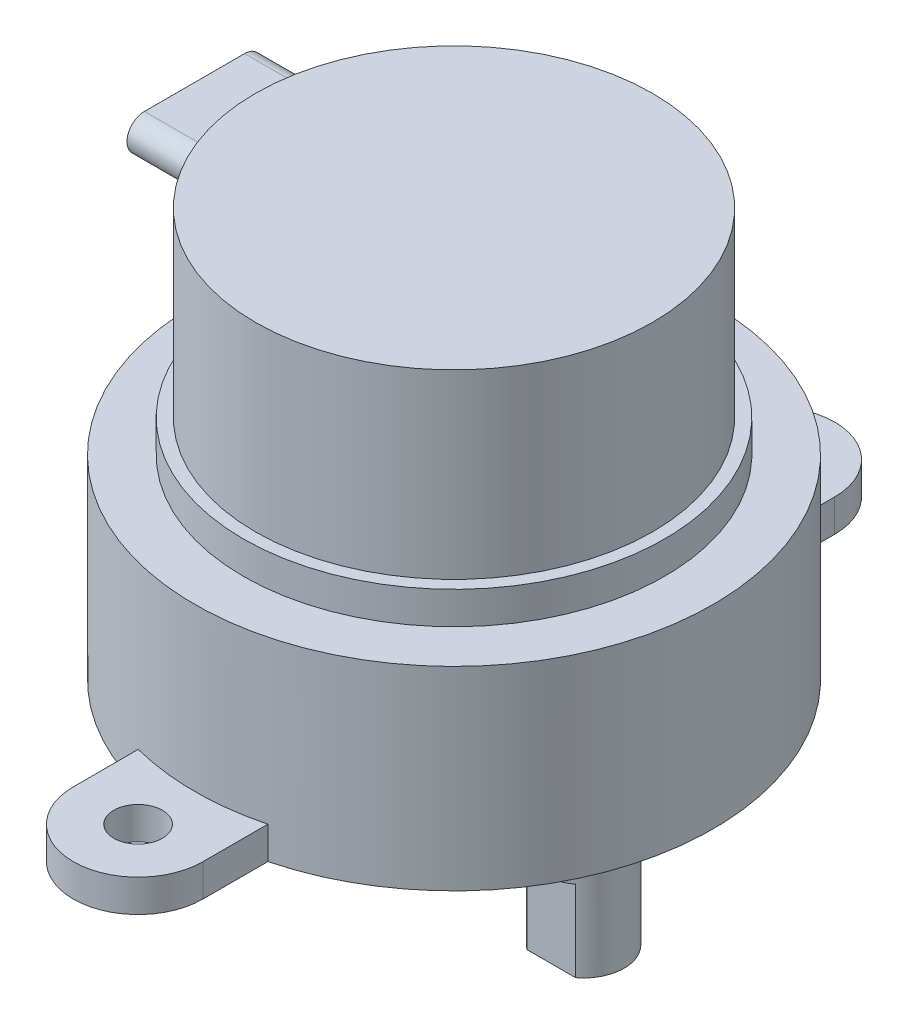
ISO-10303-21;
HEADER;
FILE_DESCRIPTION(('STEP AP214'),'2;1');
FILE_NAME('part.step','',(''),(''),'','','');
FILE_SCHEMA(('AUTOMOTIVE_DESIGN { 1 0 10303 214 1 1 1 1 }'));
ENDSEC;
DATA;
#1=APPLICATION_CONTEXT('core data for automotive mechanical design processes');
#2=APPLICATION_PROTOCOL_DEFINITION('international standard','automotive_design',2000,#1);
#3=PRODUCT_CONTEXT('',#1,'mechanical');
#4=PRODUCT('Part','Part','',(#3));
#5=PRODUCT_RELATED_PRODUCT_CATEGORY('part','',(#4));
#6=PRODUCT_DEFINITION_FORMATION('','',#4);
#7=PRODUCT_DEFINITION_CONTEXT('part definition',#1,'design');
#8=PRODUCT_DEFINITION('design','',#6,#7);
#9=PRODUCT_DEFINITION_SHAPE('','',#8);
#10=(LENGTH_UNIT() NAMED_UNIT(*) SI_UNIT(.MILLI.,.METRE.));
#11=(NAMED_UNIT(*) PLANE_ANGLE_UNIT() SI_UNIT($,.RADIAN.));
#12=(NAMED_UNIT(*) SI_UNIT($,.STERADIAN.) SOLID_ANGLE_UNIT());
#13=UNCERTAINTY_MEASURE_WITH_UNIT(LENGTH_MEASURE(1.E-05),#10,'distance_accuracy_value','');
#14=(GEOMETRIC_REPRESENTATION_CONTEXT(3) GLOBAL_UNCERTAINTY_ASSIGNED_CONTEXT((#13)) GLOBAL_UNIT_ASSIGNED_CONTEXT((#10,
#11,#12)) REPRESENTATION_CONTEXT('',''));
#15=CARTESIAN_POINT('',(0.,0.,0.));
#16=DIRECTION('',(0.,0.,1.));
#17=DIRECTION('',(1.,0.,0.));
#18=AXIS2_PLACEMENT_3D('',#15,#16,#17);
#19=CARTESIAN_POINT('',(0.,0.,0.));
#20=DIRECTION('',(0.,1.,0.));
#21=DIRECTION('',(0.,0.,1.));
#22=AXIS2_PLACEMENT_3D('',#19,#20,#21);
#23=PLANE('',#22);
#24=CARTESIAN_POINT('',(8.,0.,0.));
#25=DIRECTION('',(0.,1.,0.));
#26=DIRECTION('',(0.,0.,1.));
#27=AXIS2_PLACEMENT_3D('',#24,#25,#26);
#28=CIRCLE('',#27,4.5);
#29=CARTESIAN_POINT('',(8.,0.,4.5));
#30=VERTEX_POINT('',#29);
#31=EDGE_CURVE('E342',#30,#30,#28,.F.);
#32=ORIENTED_EDGE('',*,*,#31,.F.);
#33=EDGE_LOOP('',(#32));
#34=FACE_BOUND('',#33,.T.);
#35=CARTESIAN_POINT('',(0.,0.,0.));
#36=DIRECTION('',(0.,-1.,0.));
#37=DIRECTION('',(0.,0.,-1.));
#38=AXIS2_PLACEMENT_3D('',#35,#36,#37);
#39=CIRCLE('',#38,16.);
#40=CARTESIAN_POINT('',(4.,0.,-15.4919333848297));
#41=VERTEX_POINT('',#40);
#42=CARTESIAN_POINT('',(3.99999999999999,0.,15.4919333848297));
#43=VERTEX_POINT('',#42);
#44=EDGE_CURVE('E338',#41,#43,#39,.T.);
#45=ORIENTED_EDGE('',*,*,#44,.T.);
#46=DIRECTION('',(0.,0.,1.));
#47=VECTOR('',#46,1.);
#48=CARTESIAN_POINT('',(4.,0.,-19.5));
#49=LINE('',#48,#47);
#50=CARTESIAN_POINT('',(3.99999999999999,0.,19.5));
#51=VERTEX_POINT('',#50);
#52=EDGE_CURVE('E241',#43,#51,#49,.T.);
#53=ORIENTED_EDGE('',*,*,#52,.T.);
#54=CARTESIAN_POINT('',(0.,0.,19.5));
#55=DIRECTION('',(0.,-1.,0.));
#56=DIRECTION('',(0.,0.,-1.));
#57=AXIS2_PLACEMENT_3D('',#54,#55,#56);
#58=CIRCLE('',#57,4.);
#59=CARTESIAN_POINT('',(-4.00000000000001,0.,19.5));
#60=VERTEX_POINT('',#59);
#61=EDGE_CURVE('E245',#51,#60,#58,.T.);
#62=ORIENTED_EDGE('',*,*,#61,.T.);
#63=DIRECTION('',(0.,0.,-1.));
#64=VECTOR('',#63,1.);
#65=CARTESIAN_POINT('',(-4.,0.,-19.5));
#66=LINE('',#65,#64);
#67=CARTESIAN_POINT('',(-4.,0.,15.4919333848297));
#68=VERTEX_POINT('',#67);
#69=EDGE_CURVE('E69',#60,#68,#66,.T.);
#70=ORIENTED_EDGE('',*,*,#69,.T.);
#71=CARTESIAN_POINT('',(-4.,0.,-15.4919333848297));
#72=VERTEX_POINT('',#71);
#73=EDGE_CURVE('E337',#68,#72,#39,.T.);
#74=ORIENTED_EDGE('',*,*,#73,.T.);
#75=CARTESIAN_POINT('',(-4.,0.,-19.5));
#76=VERTEX_POINT('',#75);
#77=EDGE_CURVE('E248',#72,#76,#66,.T.);
#78=ORIENTED_EDGE('',*,*,#77,.T.);
#79=CARTESIAN_POINT('',(0.,0.,-19.5));
#80=DIRECTION('',(0.,-1.,0.));
#81=DIRECTION('',(0.,0.,-1.));
#82=AXIS2_PLACEMENT_3D('',#79,#80,#81);
#83=CIRCLE('',#82,4.);
#84=CARTESIAN_POINT('',(4.,0.,-19.5));
#85=VERTEX_POINT('',#84);
#86=EDGE_CURVE('E215',#76,#85,#83,.T.);
#87=ORIENTED_EDGE('',*,*,#86,.T.);
#88=EDGE_CURVE('E242',#85,#41,#49,.T.);
#89=ORIENTED_EDGE('',*,*,#88,.T.);
#90=EDGE_LOOP('',(#45,#53,#62,#70,#74,#78,#87,#89));
#91=FACE_BOUND('',#90,.T.);
#92=CARTESIAN_POINT('',(0.,0.,-19.5));
#93=DIRECTION('',(0.,-1.,0.));
#94=DIRECTION('',(0.,0.,-1.));
#95=AXIS2_PLACEMENT_3D('',#92,#93,#94);
#96=CIRCLE('',#95,1.5);
#97=CARTESIAN_POINT('',(0.,0.,-21.));
#98=VERTEX_POINT('',#97);
#99=EDGE_CURVE('E207',#98,#98,#96,.T.);
#100=ORIENTED_EDGE('',*,*,#99,.F.);
#101=EDGE_LOOP('',(#100));
#102=FACE_BOUND('',#101,.T.);
#103=CARTESIAN_POINT('',(0.,0.,19.5));
#104=DIRECTION('',(0.,-1.,0.));
#105=DIRECTION('',(0.,0.,-1.));
#106=AXIS2_PLACEMENT_3D('',#103,#104,#105);
#107=CIRCLE('',#106,1.5);
#108=CARTESIAN_POINT('',(0.,0.,18.));
#109=VERTEX_POINT('',#108);
#110=EDGE_CURVE('E196',#109,#109,#107,.T.);
#111=ORIENTED_EDGE('',*,*,#110,.F.);
#112=EDGE_LOOP('',(#111));
#113=FACE_BOUND('',#112,.T.);
#114=ADVANCED_FACE('F41',(#34,#91,#102,#113),#23,.F.);
#115=CARTESIAN_POINT('',(0.,0.,0.));
#116=DIRECTION('',(0.,-1.,0.));
#117=DIRECTION('',(0.,0.,-1.));
#118=AXIS2_PLACEMENT_3D('',#115,#116,#117);
#119=CYLINDRICAL_SURFACE('',#118,16.);
#120=ORIENTED_EDGE('',*,*,#73,.F.);
#121=DIRECTION('',(0.,-1.,0.));
#122=VECTOR('',#121,1.);
#123=CARTESIAN_POINT('',(-4.,0.,15.4919333848297));
#124=LINE('',#123,#122);
#125=CARTESIAN_POINT('',(-4.,2.,15.4919333848297));
#126=VERTEX_POINT('',#125);
#127=EDGE_CURVE('E377',#68,#126,#124,.F.);
#128=ORIENTED_EDGE('',*,*,#127,.T.);
#129=CARTESIAN_POINT('',(0.,2.,0.));
#130=DIRECTION('',(0.,-1.,0.));
#131=DIRECTION('',(0.,0.,-1.));
#132=AXIS2_PLACEMENT_3D('',#129,#130,#131);
#133=CIRCLE('',#132,16.);
#134=CARTESIAN_POINT('',(3.99999999999999,2.,15.4919333848297));
#135=VERTEX_POINT('',#134);
#136=EDGE_CURVE('E365',#135,#126,#133,.T.);
#137=ORIENTED_EDGE('',*,*,#136,.F.);
#138=DIRECTION('',(0.,-1.,0.));
#139=VECTOR('',#138,1.);
#140=CARTESIAN_POINT('',(3.99999999999999,0.,15.4919333848297));
#141=LINE('',#140,#139);
#142=EDGE_CURVE('E373',#135,#43,#141,.T.);
#143=ORIENTED_EDGE('',*,*,#142,.T.);
#144=ORIENTED_EDGE('',*,*,#44,.F.);
#145=DIRECTION('',(0.,-1.,0.));
#146=VECTOR('',#145,1.);
#147=CARTESIAN_POINT('',(4.,0.,-15.4919333848297));
#148=LINE('',#147,#146);
#149=CARTESIAN_POINT('',(4.,2.,-15.4919333848297));
#150=VERTEX_POINT('',#149);
#151=EDGE_CURVE('E364',#41,#150,#148,.F.);
#152=ORIENTED_EDGE('',*,*,#151,.T.);
#153=CARTESIAN_POINT('',(-4.,2.,-15.4919333848297));
#154=VERTEX_POINT('',#153);
#155=EDGE_CURVE('E361',#154,#150,#133,.T.);
#156=ORIENTED_EDGE('',*,*,#155,.F.);
#157=DIRECTION('',(0.,-1.,0.));
#158=VECTOR('',#157,1.);
#159=CARTESIAN_POINT('',(-4.,0.,-15.4919333848297));
#160=LINE('',#159,#158);
#161=EDGE_CURVE('E369',#154,#72,#160,.T.);
#162=ORIENTED_EDGE('',*,*,#161,.T.);
#163=EDGE_LOOP('',(#120,#128,#137,#143,#144,#152,#156,#162));
#164=FACE_BOUND('',#163,.T.);
#165=CARTESIAN_POINT('',(0.,12.,0.));
#166=DIRECTION('',(0.,-1.,0.));
#167=DIRECTION('',(0.,0.,-1.));
#168=AXIS2_PLACEMENT_3D('',#165,#166,#167);
#169=CIRCLE('',#168,16.);
#170=CARTESIAN_POINT('',(0.,12.,-16.));
#171=VERTEX_POINT('',#170);
#172=EDGE_CURVE('E333',#171,#171,#169,.T.);
#173=ORIENTED_EDGE('',*,*,#172,.T.);
#174=EDGE_LOOP('',(#173));
#175=FACE_BOUND('',#174,.T.);
#176=ADVANCED_FACE('F494',(#164,#175),#119,.T.);
#177=CARTESIAN_POINT('',(-16.,12.,0.));
#178=DIRECTION('',(0.,-1.,0.));
#179=DIRECTION('',(0.,0.,-1.));
#180=AXIS2_PLACEMENT_3D('',#177,#178,#179);
#181=PLANE('',#180);
#182=ORIENTED_EDGE('',*,*,#172,.F.);
#183=EDGE_LOOP('',(#182));
#184=FACE_BOUND('',#183,.T.);
#185=CARTESIAN_POINT('',(0.,12.,0.));
#186=DIRECTION('',(0.,-1.,0.));
#187=DIRECTION('',(0.,0.,-1.));
#188=AXIS2_PLACEMENT_3D('',#185,#186,#187);
#189=CIRCLE('',#188,13.);
#190=CARTESIAN_POINT('',(0.,12.,-13.));
#191=VERTEX_POINT('',#190);
#192=EDGE_CURVE('E329',#191,#191,#189,.T.);
#193=ORIENTED_EDGE('',*,*,#192,.T.);
#194=EDGE_LOOP('',(#193));
#195=FACE_BOUND('',#194,.T.);
#196=ADVANCED_FACE('F499',(#184,#195),#181,.F.);
#197=CARTESIAN_POINT('',(0.,0.,0.));
#198=DIRECTION('',(0.,-1.,0.));
#199=DIRECTION('',(0.,0.,-1.));
#200=AXIS2_PLACEMENT_3D('',#197,#198,#199);
#201=CYLINDRICAL_SURFACE('',#200,13.);
#202=ORIENTED_EDGE('',*,*,#192,.F.);
#203=EDGE_LOOP('',(#202));
#204=FACE_BOUND('',#203,.T.);
#205=CARTESIAN_POINT('',(0.,14.,0.));
#206=DIRECTION('',(0.,-1.,0.));
#207=DIRECTION('',(0.,0.,-1.));
#208=AXIS2_PLACEMENT_3D('',#205,#206,#207);
#209=CIRCLE('',#208,13.);
#210=CARTESIAN_POINT('',(0.,14.,-13.));
#211=VERTEX_POINT('',#210);
#212=EDGE_CURVE('E325',#211,#211,#209,.T.);
#213=ORIENTED_EDGE('',*,*,#212,.T.);
#214=EDGE_LOOP('',(#213));
#215=FACE_BOUND('',#214,.T.);
#216=ADVANCED_FACE('F725',(#204,#215),#201,.T.);
#217=CARTESIAN_POINT('',(-13.,14.,0.));
#218=DIRECTION('',(0.,-1.,0.));
#219=DIRECTION('',(0.,0.,-1.));
#220=AXIS2_PLACEMENT_3D('',#217,#218,#219);
#221=PLANE('',#220);
#222=ORIENTED_EDGE('',*,*,#212,.F.);
#223=EDGE_LOOP('',(#222));
#224=FACE_BOUND('',#223,.T.);
#225=CARTESIAN_POINT('',(0.,14.,0.));
#226=DIRECTION('',(0.,-1.,0.));
#227=DIRECTION('',(0.,0.,-1.));
#228=AXIS2_PLACEMENT_3D('',#225,#226,#227);
#229=CIRCLE('',#228,12.25);
#230=CARTESIAN_POINT('',(0.,14.,-12.25));
#231=VERTEX_POINT('',#230);
#232=EDGE_CURVE('E321',#231,#231,#229,.T.);
#233=ORIENTED_EDGE('',*,*,#232,.T.);
#234=EDGE_LOOP('',(#233));
#235=FACE_BOUND('',#234,.T.);
#236=ADVANCED_FACE('F490',(#224,#235),#221,.F.);
#237=CARTESIAN_POINT('',(0.,0.,0.));
#238=DIRECTION('',(0.,-1.,0.));
#239=DIRECTION('',(0.,0.,-1.));
#240=AXIS2_PLACEMENT_3D('',#237,#238,#239);
#241=CYLINDRICAL_SURFACE('',#240,12.25);
#242=CARTESIAN_POINT('',(0.,21.7523329488224,0.));
#243=DIRECTION('',(0.,-1.,0.));
#244=DIRECTION('',(0.,0.,-1.));
#245=AXIS2_PLACEMENT_3D('',#242,#243,#244);
#246=CIRCLE('',#245,12.25);
#247=CARTESIAN_POINT('',(-11.8487346039343,21.7523329488224,3.10966047753271));
#248=VERTEX_POINT('',#247);
#249=CARTESIAN_POINT('',(-11.8575539790749,21.7523329488224,-3.07585982016822));
#250=VERTEX_POINT('',#249);
#251=EDGE_CURVE('E54',#248,#250,#246,.T.);
#252=ORIENTED_EDGE('',*,*,#251,.T.);
#253=CARTESIAN_POINT('',(-11.5238931220212,22.8312760496402,-4.15480292098597));
#254=CARTESIAN_POINT('',(-11.5238945881606,22.8894283660437,-4.15479997317814));
#255=CARTESIAN_POINT('',(-11.5255989359239,22.9476221174706,-4.15008100781265));
#256=CARTESIAN_POINT('',(-11.5323170927868,23.0623450112207,-4.13137468937299));
#257=CARTESIAN_POINT('',(-11.5373347967195,23.1188721126142,-4.1173764284597));
#258=CARTESIAN_POINT('',(-11.550368160855,23.2285287475182,-4.08067042155731));
#259=CARTESIAN_POINT('',(-11.5583780578731,23.281664583972,-4.05797941630594));
#260=CARTESIAN_POINT('',(-11.5769546981942,23.383287335724,-4.00467388560479));
#261=CARTESIAN_POINT('',(-11.5875212246238,23.4317746448601,-3.97406003221792));
#262=CARTESIAN_POINT('',(-11.6110276279431,23.5243249418181,-3.9048568989098));
#263=CARTESIAN_POINT('',(-11.6240275109976,23.5682185773314,-3.8660618473681));
#264=CARTESIAN_POINT('',(-11.6515851428771,23.6489539869432,-3.78219648947696));
#265=CARTESIAN_POINT('',(-11.6661432965298,23.6857939215737,-3.73712455151644));
#266=CARTESIAN_POINT('',(-11.6970270042961,23.7534049331076,-3.6393434391303));
#267=CARTESIAN_POINT('',(-11.7134053692853,23.7837494167182,-3.58635568071019));
#268=CARTESIAN_POINT('',(-11.7465854431712,23.8350648557633,-3.47613899747225));
#269=CARTESIAN_POINT('',(-11.7633872385624,23.8560338793981,-3.41890920141812));
#270=CARTESIAN_POINT('',(-11.7973560313115,23.8885777202673,-3.29982431213522));
#271=CARTESIAN_POINT('',(-11.814517685662,23.8998331194523,-3.23788005564707));
#272=CARTESIAN_POINT('',(-11.8480939570263,23.9114157601803,-3.11277426082511));
#273=CARTESIAN_POINT('',(-11.8645085663483,23.9117428892273,-3.04961270996713));
#274=CARTESIAN_POINT('',(-11.8960715360193,23.9013380283989,-2.92406565693693));
#275=CARTESIAN_POINT('',(-11.9112232808907,23.8906366976249,-2.86167848866916));
#276=CARTESIAN_POINT('',(-11.9399392602354,23.8583630431442,-2.73939689352899));
#277=CARTESIAN_POINT('',(-11.9535037075029,23.8367921786765,-2.67950213321808));
#278=CARTESIAN_POINT('',(-11.9784656056057,23.7839419725489,-2.5655762020296));
#279=CARTESIAN_POINT('',(-11.9899090489016,23.7529209691734,-2.51143530787798));
#280=CARTESIAN_POINT('',(-12.0108957312213,23.6818002762694,-2.40906973819683));
#281=CARTESIAN_POINT('',(-12.0204392579531,23.6417019633041,-2.36084416732362));
#282=CARTESIAN_POINT('',(-12.0373383425546,23.5547341993205,-2.27308915884723));
#283=CARTESIAN_POINT('',(-12.0447456169154,23.5080746611385,-2.23336154496076));
#284=CARTESIAN_POINT('',(-12.0577094897513,23.4085348065304,-2.16227923148187));
#285=CARTESIAN_POINT('',(-12.0632662712691,23.3556551060766,-2.13092370381956));
#286=CARTESIAN_POINT('',(-12.0724856683461,23.2461631030909,-2.07805222861137));
#287=CARTESIAN_POINT('',(-12.0761791433631,23.1896303967272,-2.05637670891772));
#288=CARTESIAN_POINT('',(-12.0818551132263,23.0736590303805,-2.02276301203886));
#289=CARTESIAN_POINT('',(-12.0838376918557,23.0142205128469,-2.01082435803687));
#290=CARTESIAN_POINT('',(-12.0861119136353,22.8946175863696,-1.99710978060337));
#291=CARTESIAN_POINT('',(-12.0864164927381,22.8344623238366,-1.99525611187983));
#292=CARTESIAN_POINT('',(-12.0853743012899,22.7146936860837,-2.00155884700656));
#293=CARTESIAN_POINT('',(-12.0840275642409,22.6550802998949,-2.00971504777561));
#294=CARTESIAN_POINT('',(-12.079666347944,22.538194429962,-2.03576348089923));
#295=CARTESIAN_POINT('',(-12.0766547913758,22.4809180321963,-2.0536386501823));
#296=CARTESIAN_POINT('',(-12.0689287344456,22.3702099054284,-2.09856512647862));
#297=CARTESIAN_POINT('',(-12.064214240367,22.3167781622415,-2.12561639963465));
#298=CARTESIAN_POINT('',(-12.0530275151505,22.2150969707111,-2.18815806025319));
#299=CARTESIAN_POINT('',(-12.0465502453426,22.1668629397107,-2.22367260213835));
#300=CARTESIAN_POINT('',(-12.0318253397542,22.0770680640166,-2.30201289142141));
#301=CARTESIAN_POINT('',(-12.0235776595544,22.0355073868022,-2.34483882225563));
#302=CARTESIAN_POINT('',(-12.0052498540679,21.9597874732745,-2.43694415352733));
#303=CARTESIAN_POINT('',(-11.9951532775447,21.9257012634293,-2.48628028099823));
#304=CARTESIAN_POINT('',(-11.9732691256823,21.866268599959,-2.58961643796575));
#305=CARTESIAN_POINT('',(-11.9614814189837,21.8409228257726,-2.64361682963162));
#306=CARTESIAN_POINT('',(-11.9361440209042,21.7991341962293,-2.75578122559304));
#307=CARTESIAN_POINT('',(-11.9225652716441,21.7828684130922,-2.81400457955029));
#308=CARTESIAN_POINT('',(-11.8940895645856,21.760274512325,-2.93203339563384));
#309=CARTESIAN_POINT('',(-11.8791924177089,21.7539478225601,-2.99183908382598));
#310=CARTESIAN_POINT('',(-11.8480151821253,21.7512257761645,-3.11304602692624));
#311=CARTESIAN_POINT('',(-11.8317085590634,21.7551041558719,-3.17444660767309));
#312=CARTESIAN_POINT('',(-11.7985467332454,21.7731649631101,-3.2955638112846));
#313=CARTESIAN_POINT('',(-11.7816914407819,21.7873490837946,-3.35528015576735));
#314=CARTESIAN_POINT('',(-11.7475843781373,21.8260662285621,-3.47283682547258));
#315=CARTESIAN_POINT('',(-11.730332670597,21.8508363551589,-3.53059924393132));
#316=CARTESIAN_POINT('',(-11.6965005077504,21.9101154764605,-3.6411151421086));
#317=CARTESIAN_POINT('',(-11.6799200850363,21.944624943379,-3.69386837879016));
#318=CARTESIAN_POINT('',(-11.6481668991548,22.0225342154041,-3.79281030108377));
#319=CARTESIAN_POINT('',(-11.6329936158232,22.0659307161372,-3.83900141584059));
#320=CARTESIAN_POINT('',(-11.6048130808091,22.1605544433558,-3.92336548675227));
#321=CARTESIAN_POINT('',(-11.5918059292909,22.2117820317492,-3.96153807214309));
#322=CARTESIAN_POINT('',(-11.5691347258386,22.3186764690613,-4.02725590951896));
#323=CARTESIAN_POINT('',(-11.5593666307283,22.3741152550471,-4.0551360709747));
#324=CARTESIAN_POINT('',(-11.5431569784585,22.4893251916625,-4.10105194365947));
#325=CARTESIAN_POINT('',(-11.5367098520126,22.5490888961002,-4.11910413936453));
#326=CARTESIAN_POINT('',(-11.5294072932989,22.646337836821,-4.13948395160904));
#327=CARTESIAN_POINT('',(-11.5273448703795,22.6830540222551,-4.14521854742784));
#328=CARTESIAN_POINT('',(-11.5245873396192,22.7569331861291,-4.15287890880669));
#329=CARTESIAN_POINT('',(-11.5238921846394,22.7940961491212,-4.1548048056779));
#330=CARTESIAN_POINT('',(-11.5238931220212,22.8312760496402,-4.15480292098597));
#331=B_SPLINE_CURVE_WITH_KNOTS('',3,(#253,#254,#255,#256,#257,#258,#259,#260,#261,#262,#263,
#264,#265,#266,#267,#268,#269,#270,#271,#272,#273,#274,#275,#276,#277,#278,#279,#280,#281,#282,
#283,#284,#285,#286,#287,#288,#289,#290,#291,#292,#293,#294,#295,#296,#297,#298,#299,#300,#301,
#302,#303,#304,#305,#306,#307,#308,#309,#310,#311,#312,#313,#314,#315,#316,#317,#318,#319,#320,
#321,#322,#323,#324,#325,#326,#327,#328,#329,#330),.UNSPECIFIED.,.T.,.F.,(4,2,2,2,2,2,2,2,2,2,2,
2,2,2,2,2,2,2,2,2,2,2,2,2,2,2,2,2,2,2,2,2,2,2,2,2,2,2,4),(0.,0.174316266933269,
0.348837807379458,0.523024925202516,0.697197272282463,0.87642709412653,1.05570359215418,
1.24450798149456,1.43335125579542,1.62819054895799,1.8230318478023,2.01733294546968,
2.21160796508968,2.40098750080591,2.59033833655965,2.77462208286934,2.95888759520555,
3.13999199282697,3.32108752118726,3.50078498232776,3.68047879780868,3.85985814841577,
4.0392368371711,4.21913374229638,4.3990351615406,4.58062283037138,4.76222461175871,
4.94725412306206,5.13231021355562,5.32238043839226,5.51248189736127,5.70708484335562,
5.90169722633465,6.09623737956821,6.29078652604993,6.47828747843717,6.66547295832116,
6.77692655675243,6.88837631257051),.UNSPECIFIED.);
#332=CARTESIAN_POINT('',(-11.8575539790749,23.9102191504579,-3.07585982016822));
#333=VERTEX_POINT('',#332);
#334=EDGE_CURVE('E11',#250,#333,#331,.T.);
#335=ORIENTED_EDGE('',*,*,#334,.T.);
#336=CARTESIAN_POINT('',(0.,23.9102191504579,0.));
#337=DIRECTION('',(0.,1.,0.));
#338=DIRECTION('',(0.,0.,1.));
#339=AXIS2_PLACEMENT_3D('',#336,#337,#338);
#340=CIRCLE('',#339,12.25);
#341=CARTESIAN_POINT('',(-11.8487346039343,23.9102191504579,3.10966047753271));
#342=VERTEX_POINT('',#341);
#343=EDGE_CURVE('E167',#333,#342,#340,.T.);
#344=ORIENTED_EDGE('',*,*,#343,.T.);
#345=CARTESIAN_POINT('',(-12.0805085545232,22.8312760496402,2.03071737671496));
#346=CARTESIAN_POINT('',(-12.0805085006993,22.8911659232264,2.03072004216357));
#347=CARTESIAN_POINT('',(-12.0796706701215,22.9510969223037,2.03572148434492));
#348=CARTESIAN_POINT('',(-12.0763050563667,23.0692990532982,2.05559086345804));
#349=CARTESIAN_POINT('',(-12.0737753542873,23.1275682220556,2.07047000342585));
#350=CARTESIAN_POINT('',(-12.0669942114307,23.2407140212628,2.1096310453249));
#351=CARTESIAN_POINT('',(-12.0627438312151,23.2955927175006,2.13390715491336));
#352=CARTESIAN_POINT('',(-12.0524845759308,23.4004387545016,2.19110832182114));
#353=CARTESIAN_POINT('',(-12.0464761128655,23.4504072423018,2.2240313525662));
#354=CARTESIAN_POINT('',(-12.0326492216515,23.5442627441359,2.2976633641957));
#355=CARTESIAN_POINT('',(-12.0248238909115,23.588125518452,2.33840193243564));
#356=CARTESIAN_POINT('',(-12.0073880014804,23.6683778432336,2.42634271579571));
#357=CARTESIAN_POINT('',(-11.9977773071749,23.7047668255552,2.4735454218534));
#358=CARTESIAN_POINT('',(-11.9767057137369,23.7695775127639,2.57364827300377));
#359=CARTESIAN_POINT('',(-11.9652226926875,23.7978911973513,2.62661365055237));
#360=CARTESIAN_POINT('',(-11.9406443778895,23.8452739547233,2.73617663104178));
#361=CARTESIAN_POINT('',(-11.9275489180404,23.8643420741032,2.79277460789586));
#362=CARTESIAN_POINT('',(-11.8996615226446,23.8931960006518,2.90933415245713));
#363=CARTESIAN_POINT('',(-11.8848376385789,23.9027595523732,2.96934304232387));
#364=CARTESIAN_POINT('',(-11.8540835784275,23.9117280948703,3.08983342427292));
#365=CARTESIAN_POINT('',(-11.8381532289117,23.9111314895233,3.15031498911897));
#366=CARTESIAN_POINT('',(-11.8051485719372,23.8997519455333,3.27185621626524));
#367=CARTESIAN_POINT('',(-11.7880546314592,23.8886804760874,3.33288359323992));
#368=CARTESIAN_POINT('',(-11.7536921182208,23.8562946107236,3.452111614953));
#369=CARTESIAN_POINT('',(-11.7364235183514,23.8349786001,3.51031181248928));
#370=CARTESIAN_POINT('',(-11.7020280570773,23.7821765470609,3.62334005138425));
#371=CARTESIAN_POINT('',(-11.6849093829157,23.7505138470785,3.67808824416365));
#372=CARTESIAN_POINT('',(-11.6518660316973,23.6779092210579,3.78146356867153));
#373=CARTESIAN_POINT('',(-11.6359413589375,23.6369672616276,3.83009067837186));
#374=CARTESIAN_POINT('',(-11.6062562934753,23.5473977229331,3.91911886445676));
#375=CARTESIAN_POINT('',(-11.5924704973807,23.4988767711151,3.95961849830402));
#376=CARTESIAN_POINT('',(-11.5675753438114,23.3950373692833,4.03176915558578));
#377=CARTESIAN_POINT('',(-11.5564651449247,23.3397210645326,4.0634229613276));
#378=CARTESIAN_POINT('',(-11.5380632529886,23.2266708034205,4.11537643035753));
#379=CARTESIAN_POINT('',(-11.5306143901954,23.169178884128,4.13614658899414));
#380=CARTESIAN_POINT('',(-11.5192417848181,23.0511903310073,4.16771578501934));
#381=CARTESIAN_POINT('',(-11.5153166917384,22.9906948576893,4.17851864245112));
#382=CARTESIAN_POINT('',(-11.5113606082597,22.8718395517254,4.18940420279325));
#383=CARTESIAN_POINT('',(-11.5111359153627,22.8135344362823,4.19002016045603));
#384=CARTESIAN_POINT('',(-11.5140980288599,22.6976768971708,4.18187340245933));
#385=CARTESIAN_POINT('',(-11.5172844219396,22.6401243831665,4.17311182305779));
#386=CARTESIAN_POINT('',(-11.5267936762632,22.5283529679763,4.14677187620686));
#387=CARTESIAN_POINT('',(-11.5330646517675,22.4740950584279,4.12933931069576));
#388=CARTESIAN_POINT('',(-11.5483657914426,22.3693221857433,4.08635108629495));
#389=CARTESIAN_POINT('',(-11.557396285609,22.3188076711573,4.06079445587846));
#390=CARTESIAN_POINT('',(-11.5780718450431,22.2212322629245,4.00147042852011));
#391=CARTESIAN_POINT('',(-11.5897891021545,22.1743263946856,3.96747364321907));
#392=CARTESIAN_POINT('',(-11.6151033115996,22.0868185357701,3.89274060742437));
#393=CARTESIAN_POINT('',(-11.6287007332934,22.0462181245633,3.8520026735849));
#394=CARTESIAN_POINT('',(-11.6579682781098,21.9701636371033,3.76252633194372));
#395=CARTESIAN_POINT('',(-11.6737106610515,21.935105601881,3.71347478555065));
#396=CARTESIAN_POINT('',(-11.7059910801424,21.8737009182208,3.61042762318661));
#397=CARTESIAN_POINT('',(-11.7225293035551,21.8473563316778,3.55643084086091));
#398=CARTESIAN_POINT('',(-11.756490710674,21.8030771169822,3.44254227071793));
#399=CARTESIAN_POINT('',(-11.7739220787617,21.7855381406823,3.38249866802269));
#400=CARTESIAN_POINT('',(-11.8083795183928,21.7610628022216,3.26017032725489));
#401=CARTESIAN_POINT('',(-11.8254055574204,21.7541272878777,3.19788541038195));
#402=CARTESIAN_POINT('',(-11.8586523265602,21.7511384494291,3.07231413758897));
#403=CARTESIAN_POINT('',(-11.8748657930734,21.7551698771012,3.00902376150991));
#404=CARTESIAN_POINT('',(-11.905897593791,21.7743402495625,2.8837932845292));
#405=CARTESIAN_POINT('',(-11.920716072638,21.7894780413281,2.82185304414849));
#406=CARTESIAN_POINT('',(-11.9483289285527,21.8301542453459,2.70251952052639));
#407=CARTESIAN_POINT('',(-11.9611591391257,21.8554686515709,2.64505825832063));
#408=CARTESIAN_POINT('',(-11.9849443486052,21.9158850345255,2.53510851088985));
#409=CARTESIAN_POINT('',(-11.9958997186878,21.9509850702953,2.48261904228291));
#410=CARTESIAN_POINT('',(-12.0155328692103,22.0288817044502,2.3857592089986));
#411=CARTESIAN_POINT('',(-12.0242671443155,22.0714276057372,2.34119859151789));
#412=CARTESIAN_POINT('',(-12.0398273791194,22.1636917523665,2.25981811889011));
#413=CARTESIAN_POINT('',(-12.0466531116682,22.2134108503781,2.22299918526818));
#414=CARTESIAN_POINT('',(-12.0582889911421,22.3174787366778,2.15898284532632));
#415=CARTESIAN_POINT('',(-12.0631376993435,22.3717112978741,2.13160315545511));
#416=CARTESIAN_POINT('',(-12.0710522001765,22.4840689920339,2.08632025707044));
#417=CARTESIAN_POINT('',(-12.0741201690448,22.5421892764844,2.06840548392305));
#418=CARTESIAN_POINT('',(-12.0777179001062,22.6391066065412,2.04726529213706));
#419=CARTESIAN_POINT('',(-12.0787647211875,22.6772629836975,2.04106850377985));
#420=CARTESIAN_POINT('',(-12.0801600638134,22.7540325553387,2.03279369788244));
#421=CARTESIAN_POINT('',(-12.0805085892408,22.7926457472824,2.03071565744124));
#422=CARTESIAN_POINT('',(-12.0805085545232,22.8312760496402,2.03071737671496));
#423=B_SPLINE_CURVE_WITH_KNOTS('',3,(#345,#346,#347,#348,#349,#350,#351,#352,#353,#354,#355,
#356,#357,#358,#359,#360,#361,#362,#363,#364,#365,#366,#367,#368,#369,#370,#371,#372,#373,#374,
#375,#376,#377,#378,#379,#380,#381,#382,#383,#384,#385,#386,#387,#388,#389,#390,#391,#392,#393,
#394,#395,#396,#397,#398,#399,#400,#401,#402,#403,#404,#405,#406,#407,#408,#409,#410,#411,#412,
#413,#414,#415,#416,#417,#418,#419,#420,#421,#422),.UNSPECIFIED.,.T.,.F.,(4,2,2,2,2,2,2,2,2,2,2,
2,2,2,2,2,2,2,2,2,2,2,2,2,2,2,2,2,2,2,2,2,2,2,2,2,2,2,4),(0.,0.179528277169227,0.35926051945334,
0.538882149782508,0.718461719795265,0.898735042236652,1.07902206365536,1.26161832248312,
1.44423340667401,1.63102481937833,1.81784557658603,2.00996689336096,2.20211850150694,
2.39773912691062,2.59336045628089,2.78644328753224,2.97946531927773,3.16325878356134,
3.34698177832113,3.52105506057742,3.69510725309971,3.86632697596455,4.03756718206853,
4.21410070930878,4.39067838579997,4.57678659033683,4.76293880287746,4.95683857655542,
5.15075385299011,5.34617194172728,5.54156974571402,5.73288336864706,5.92415907187554,
6.10992755589689,6.2957181402178,6.47768820982027,6.65943542350721,6.77523580469103,
6.89103554200103),.UNSPECIFIED.);
#424=EDGE_CURVE('E383',#342,#248,#423,.T.);
#425=ORIENTED_EDGE('',*,*,#424,.T.);
#426=EDGE_LOOP('',(#252,#335,#344,#425));
#427=FACE_BOUND('',#426,.T.);
#428=ORIENTED_EDGE('',*,*,#232,.F.);
#429=EDGE_LOOP('',(#428));
#430=FACE_BOUND('',#429,.T.);
#431=CARTESIAN_POINT('',(0.,25.2,0.));
#432=DIRECTION('',(0.,-1.,0.));
#433=DIRECTION('',(0.,0.,-1.));
#434=AXIS2_PLACEMENT_3D('',#431,#432,#433);
#435=CIRCLE('',#434,12.25);
#436=CARTESIAN_POINT('',(0.,25.2,-12.25));
#437=VERTEX_POINT('',#436);
#438=EDGE_CURVE('E317',#437,#437,#435,.T.);
#439=ORIENTED_EDGE('',*,*,#438,.T.);
#440=EDGE_LOOP('',(#439));
#441=FACE_BOUND('',#440,.T.);
#442=ADVANCED_FACE('F390',(#427,#430,#441),#241,.T.);
#443=CARTESIAN_POINT('',(-12.25,25.2,0.));
#444=DIRECTION('',(0.,-1.,0.));
#445=DIRECTION('',(0.,0.,-1.));
#446=AXIS2_PLACEMENT_3D('',#443,#444,#445);
#447=PLANE('',#446);
#448=ORIENTED_EDGE('',*,*,#438,.F.);
#449=EDGE_LOOP('',(#448));
#450=FACE_BOUND('',#449,.T.);
#451=ADVANCED_FACE('F483',(#450),#447,.F.);
#452=CARTESIAN_POINT('',(8.,-10.2,0.));
#453=DIRECTION('',(0.,-1.,0.));
#454=DIRECTION('',(0.,0.,-1.));
#455=AXIS2_PLACEMENT_3D('',#452,#453,#454);
#456=CYLINDRICAL_SURFACE('',#455,4.5);
#457=CARTESIAN_POINT('',(8.,-1.25,0.));
#458=DIRECTION('',(0.,-1.,0.));
#459=DIRECTION('',(0.,0.,-1.));
#460=AXIS2_PLACEMENT_3D('',#457,#458,#459);
#461=CIRCLE('',#460,4.5);
#462=CARTESIAN_POINT('',(8.,-1.25,-4.5));
#463=VERTEX_POINT('',#462);
#464=EDGE_CURVE('E313',#463,#463,#461,.T.);
#465=ORIENTED_EDGE('',*,*,#464,.F.);
#466=EDGE_LOOP('',(#465));
#467=FACE_BOUND('',#466,.T.);
#468=ORIENTED_EDGE('',*,*,#31,.T.);
#469=EDGE_LOOP('',(#468));
#470=FACE_BOUND('',#469,.T.);
#471=ADVANCED_FACE('F480',(#467,#470),#456,.T.);
#472=CARTESIAN_POINT('',(3.5,-1.25,0.));
#473=DIRECTION('',(0.,1.,0.));
#474=DIRECTION('',(0.,0.,1.));
#475=AXIS2_PLACEMENT_3D('',#472,#473,#474);
#476=PLANE('',#475);
#477=CARTESIAN_POINT('',(8.,-1.25,0.));
#478=DIRECTION('',(0.,-1.,0.));
#479=DIRECTION('',(0.,0.,-1.));
#480=AXIS2_PLACEMENT_3D('',#477,#478,#479);
#481=CIRCLE('',#480,4.);
#482=CARTESIAN_POINT('',(8.,-1.25,-4.));
#483=VERTEX_POINT('',#482);
#484=EDGE_CURVE('E309',#483,#483,#481,.T.);
#485=ORIENTED_EDGE('',*,*,#484,.F.);
#486=EDGE_LOOP('',(#485));
#487=FACE_BOUND('',#486,.T.);
#488=ORIENTED_EDGE('',*,*,#464,.T.);
#489=EDGE_LOOP('',(#488));
#490=FACE_BOUND('',#489,.T.);
#491=ADVANCED_FACE('F476',(#487,#490),#476,.F.);
#492=CARTESIAN_POINT('',(8.,-10.2,0.));
#493=DIRECTION('',(0.,-1.,0.));
#494=DIRECTION('',(0.,0.,-1.));
#495=AXIS2_PLACEMENT_3D('',#492,#493,#494);
#496=CYLINDRICAL_SURFACE('',#495,4.);
#497=CARTESIAN_POINT('',(8.,-2.7,0.));
#498=DIRECTION('',(0.,-1.,0.));
#499=DIRECTION('',(0.,0.,-1.));
#500=AXIS2_PLACEMENT_3D('',#497,#498,#499);
#501=CIRCLE('',#500,4.);
#502=CARTESIAN_POINT('',(8.,-2.7,-4.));
#503=VERTEX_POINT('',#502);
#504=EDGE_CURVE('E305',#503,#503,#501,.T.);
#505=ORIENTED_EDGE('',*,*,#504,.F.);
#506=EDGE_LOOP('',(#505));
#507=FACE_BOUND('',#506,.T.);
#508=ORIENTED_EDGE('',*,*,#484,.T.);
#509=EDGE_LOOP('',(#508));
#510=FACE_BOUND('',#509,.T.);
#511=ADVANCED_FACE('F472',(#507,#510),#496,.T.);
#512=CARTESIAN_POINT('',(4.,-2.7,0.));
#513=DIRECTION('',(0.,1.,0.));
#514=DIRECTION('',(0.,0.,1.));
#515=AXIS2_PLACEMENT_3D('',#512,#513,#514);
#516=PLANE('',#515);
#517=CARTESIAN_POINT('',(8.,-2.7,0.));
#518=DIRECTION('',(0.,-1.,0.));
#519=DIRECTION('',(0.,0.,-1.));
#520=AXIS2_PLACEMENT_3D('',#517,#518,#519);
#521=CIRCLE('',#520,2.5);
#522=CARTESIAN_POINT('',(8.,-2.7,-2.5));
#523=VERTEX_POINT('',#522);
#524=EDGE_CURVE('E301',#523,#523,#521,.T.);
#525=ORIENTED_EDGE('',*,*,#524,.F.);
#526=EDGE_LOOP('',(#525));
#527=FACE_BOUND('',#526,.T.);
#528=ORIENTED_EDGE('',*,*,#504,.T.);
#529=EDGE_LOOP('',(#528));
#530=FACE_BOUND('',#529,.T.);
#531=ADVANCED_FACE('F468',(#527,#530),#516,.F.);
#532=CARTESIAN_POINT('',(8.,-10.2,0.));
#533=DIRECTION('',(0.,-1.,0.));
#534=DIRECTION('',(0.,0.,-1.));
#535=AXIS2_PLACEMENT_3D('',#532,#533,#534);
#536=CYLINDRICAL_SURFACE('',#535,2.5);
#537=CARTESIAN_POINT('',(8.,-5.2,0.));
#538=DIRECTION('',(0.,-1.,0.));
#539=DIRECTION('',(0.,0.,-1.));
#540=AXIS2_PLACEMENT_3D('',#537,#538,#539);
#541=CIRCLE('',#540,2.5);
#542=CARTESIAN_POINT('',(9.5,-5.2,2.));
#543=VERTEX_POINT('',#542);
#544=CARTESIAN_POINT('',(6.5,-5.2,2.));
#545=VERTEX_POINT('',#544);
#546=EDGE_CURVE('E358',#543,#545,#541,.T.);
#547=ORIENTED_EDGE('',*,*,#546,.F.);
#548=DIRECTION('',(0.,-1.,0.));
#549=VECTOR('',#548,1.);
#550=CARTESIAN_POINT('',(9.5,-10.2,2.));
#551=LINE('',#550,#549);
#552=CARTESIAN_POINT('',(9.5,-10.2,2.));
#553=VERTEX_POINT('',#552);
#554=EDGE_CURVE('E284',#543,#553,#551,.T.);
#555=ORIENTED_EDGE('',*,*,#554,.T.);
#556=CARTESIAN_POINT('',(8.,-10.2,0.));
#557=DIRECTION('',(0.,-1.,0.));
#558=DIRECTION('',(0.,0.,-1.));
#559=AXIS2_PLACEMENT_3D('',#556,#557,#558);
#560=CIRCLE('',#559,2.5);
#561=CARTESIAN_POINT('',(9.5,-10.2,-2.));
#562=VERTEX_POINT('',#561);
#563=EDGE_CURVE('E297',#562,#553,#560,.T.);
#564=ORIENTED_EDGE('',*,*,#563,.F.);
#565=DIRECTION('',(0.,-1.,0.));
#566=VECTOR('',#565,1.);
#567=CARTESIAN_POINT('',(9.5,-10.2,-2.));
#568=LINE('',#567,#566);
#569=CARTESIAN_POINT('',(9.5,-5.2,-2.));
#570=VERTEX_POINT('',#569);
#571=EDGE_CURVE('E269',#562,#570,#568,.F.);
#572=ORIENTED_EDGE('',*,*,#571,.T.);
#573=CARTESIAN_POINT('',(8.,-5.2,0.));
#574=DIRECTION('',(0.,1.,0.));
#575=DIRECTION('',(0.,0.,1.));
#576=AXIS2_PLACEMENT_3D('',#573,#574,#575);
#577=CIRCLE('',#576,2.5);
#578=CARTESIAN_POINT('',(6.5,-5.2,-2.));
#579=VERTEX_POINT('',#578);
#580=EDGE_CURVE('E354',#570,#579,#577,.T.);
#581=ORIENTED_EDGE('',*,*,#580,.T.);
#582=DIRECTION('',(0.,-1.,0.));
#583=VECTOR('',#582,1.);
#584=CARTESIAN_POINT('',(6.5,-10.2,-2.));
#585=LINE('',#584,#583);
#586=CARTESIAN_POINT('',(6.5,-10.2,-2.));
#587=VERTEX_POINT('',#586);
#588=EDGE_CURVE('E276',#579,#587,#585,.T.);
#589=ORIENTED_EDGE('',*,*,#588,.T.);
#590=CARTESIAN_POINT('',(6.5,-10.2,2.));
#591=VERTEX_POINT('',#590);
#592=EDGE_CURVE('E296',#591,#587,#560,.T.);
#593=ORIENTED_EDGE('',*,*,#592,.F.);
#594=DIRECTION('',(0.,-1.,0.));
#595=VECTOR('',#594,1.);
#596=CARTESIAN_POINT('',(6.5,-10.2,2.));
#597=LINE('',#596,#595);
#598=EDGE_CURVE('E280',#591,#545,#597,.F.);
#599=ORIENTED_EDGE('',*,*,#598,.T.);
#600=EDGE_LOOP('',(#547,#555,#564,#572,#581,#589,#593,#599));
#601=FACE_BOUND('',#600,.T.);
#602=ORIENTED_EDGE('',*,*,#524,.T.);
#603=EDGE_LOOP('',(#602));
#604=FACE_BOUND('',#603,.T.);
#605=ADVANCED_FACE('F464',(#601,#604),#536,.T.);
#606=CARTESIAN_POINT('',(5.5,-10.2,0.));
#607=DIRECTION('',(0.,1.,0.));
#608=DIRECTION('',(0.,0.,1.));
#609=AXIS2_PLACEMENT_3D('',#606,#607,#608);
#610=PLANE('',#609);
#611=CARTESIAN_POINT('',(8.,-10.2,0.));
#612=DIRECTION('',(0.,-1.,0.));
#613=DIRECTION('',(0.,0.,-1.));
#614=AXIS2_PLACEMENT_3D('',#611,#612,#613);
#615=CIRCLE('',#614,1.24999999999999);
#616=CARTESIAN_POINT('',(8.,-10.2,-1.24999999999999));
#617=VERTEX_POINT('',#616);
#618=EDGE_CURVE('E288',#617,#617,#615,.T.);
#619=ORIENTED_EDGE('',*,*,#618,.F.);
#620=EDGE_LOOP('',(#619));
#621=FACE_BOUND('',#620,.T.);
#622=ORIENTED_EDGE('',*,*,#563,.T.);
#623=DIRECTION('',(-1.,0.,0.));
#624=VECTOR('',#623,1.);
#625=CARTESIAN_POINT('',(5.5,-10.2,2.));
#626=LINE('',#625,#624);
#627=EDGE_CURVE('E350',#553,#591,#626,.T.);
#628=ORIENTED_EDGE('',*,*,#627,.T.);
#629=ORIENTED_EDGE('',*,*,#592,.T.);
#630=DIRECTION('',(1.,0.,0.));
#631=VECTOR('',#630,1.);
#632=CARTESIAN_POINT('',(5.5,-10.2,-2.));
#633=LINE('',#632,#631);
#634=EDGE_CURVE('E346',#587,#562,#633,.T.);
#635=ORIENTED_EDGE('',*,*,#634,.T.);
#636=EDGE_LOOP('',(#622,#628,#629,#635));
#637=FACE_BOUND('',#636,.T.);
#638=ADVANCED_FACE('F460',(#621,#637),#610,.F.);
#639=CARTESIAN_POINT('',(8.,-5.2,0.));
#640=DIRECTION('',(0.,-1.,0.));
#641=DIRECTION('',(0.,0.,-1.));
#642=AXIS2_PLACEMENT_3D('',#639,#640,#641);
#643=CONICAL_SURFACE('',#642,1.25,1.02974425867665);
#644=CARTESIAN_POINT('',(8.,-4.44892422621555,0.));
#645=VERTEX_POINT('',#644);
#646=VERTEX_LOOP('',#645);
#647=FACE_BOUND('',#646,.T.);
#648=CARTESIAN_POINT('',(8.,-5.2,0.));
#649=DIRECTION('',(0.,-1.,0.));
#650=DIRECTION('',(0.,0.,-1.));
#651=AXIS2_PLACEMENT_3D('',#648,#649,#650);
#652=CIRCLE('',#651,1.25);
#653=CARTESIAN_POINT('',(8.,-5.2,-1.25));
#654=VERTEX_POINT('',#653);
#655=EDGE_CURVE('E292',#654,#654,#652,.T.);
#656=ORIENTED_EDGE('',*,*,#655,.T.);
#657=EDGE_LOOP('',(#656));
#658=FACE_BOUND('',#657,.T.);
#659=ADVANCED_FACE('F456',(#647,#658),#643,.F.);
#660=CARTESIAN_POINT('',(8.,-10.2,0.));
#661=DIRECTION('',(0.,-1.,0.));
#662=DIRECTION('',(0.,0.,-1.));
#663=AXIS2_PLACEMENT_3D('',#660,#661,#662);
#664=CYLINDRICAL_SURFACE('',#663,1.24999999999999);
#665=ORIENTED_EDGE('',*,*,#655,.F.);
#666=EDGE_LOOP('',(#665));
#667=FACE_BOUND('',#666,.T.);
#668=ORIENTED_EDGE('',*,*,#618,.T.);
#669=EDGE_LOOP('',(#668));
#670=FACE_BOUND('',#669,.T.);
#671=ADVANCED_FACE('F449',(#667,#670),#664,.F.);
#672=CARTESIAN_POINT('',(0.,-5.2,0.));
#673=DIRECTION('',(0.,1.,0.));
#674=DIRECTION('',(0.,0.,1.));
#675=AXIS2_PLACEMENT_3D('',#672,#673,#674);
#676=PLANE('',#675);
#677=DIRECTION('',(-1.,0.,0.));
#678=VECTOR('',#677,1.);
#679=CARTESIAN_POINT('',(3.96973245657643,-5.2,-2.));
#680=LINE('',#679,#678);
#681=EDGE_CURVE('E255',#570,#579,#680,.T.);
#682=ORIENTED_EDGE('',*,*,#681,.T.);
#683=ORIENTED_EDGE('',*,*,#580,.F.);
#684=EDGE_LOOP('',(#682,#683));
#685=FACE_BOUND('',#684,.T.);
#686=ADVANCED_FACE('F446',(#685),#676,.F.);
#687=CARTESIAN_POINT('',(3.96973245657643,-5.2,-2.));
#688=DIRECTION('',(0.,0.,1.));
#689=DIRECTION('',(1.,0.,0.));
#690=AXIS2_PLACEMENT_3D('',#687,#688,#689);
#691=PLANE('',#690);
#692=ORIENTED_EDGE('',*,*,#681,.F.);
#693=ORIENTED_EDGE('',*,*,#571,.F.);
#694=ORIENTED_EDGE('',*,*,#634,.F.);
#695=ORIENTED_EDGE('',*,*,#588,.F.);
#696=EDGE_LOOP('',(#692,#693,#694,#695));
#697=FACE_BOUND('',#696,.T.);
#698=ADVANCED_FACE('F441',(#697),#691,.F.);
#699=CARTESIAN_POINT('',(0.,-5.2,0.));
#700=DIRECTION('',(0.,-1.,0.));
#701=DIRECTION('',(0.,0.,-1.));
#702=AXIS2_PLACEMENT_3D('',#699,#700,#701);
#703=PLANE('',#702);
#704=ORIENTED_EDGE('',*,*,#546,.T.);
#705=DIRECTION('',(1.,0.,0.));
#706=VECTOR('',#705,1.);
#707=CARTESIAN_POINT('',(3.41023990585499,-5.2,2.));
#708=LINE('',#707,#706);
#709=EDGE_CURVE('E265',#545,#543,#708,.T.);
#710=ORIENTED_EDGE('',*,*,#709,.T.);
#711=EDGE_LOOP('',(#704,#710));
#712=FACE_BOUND('',#711,.T.);
#713=ADVANCED_FACE('F438',(#712),#703,.T.);
#714=CARTESIAN_POINT('',(3.41023990585499,-5.2,2.));
#715=DIRECTION('',(0.,0.,-1.));
#716=DIRECTION('',(-1.,0.,0.));
#717=AXIS2_PLACEMENT_3D('',#714,#715,#716);
#718=PLANE('',#717);
#719=ORIENTED_EDGE('',*,*,#709,.F.);
#720=ORIENTED_EDGE('',*,*,#598,.F.);
#721=ORIENTED_EDGE('',*,*,#627,.F.);
#722=ORIENTED_EDGE('',*,*,#554,.F.);
#723=EDGE_LOOP('',(#719,#720,#721,#722));
#724=FACE_BOUND('',#723,.T.);
#725=ADVANCED_FACE('F415',(#724),#718,.F.);
#726=CARTESIAN_POINT('',(0.,2.,-19.5));
#727=DIRECTION('',(0.,-1.,0.));
#728=DIRECTION('',(0.,0.,-1.));
#729=AXIS2_PLACEMENT_3D('',#726,#727,#728);
#730=CYLINDRICAL_SURFACE('',#729,1.5);
#731=CARTESIAN_POINT('',(0.,2.,-19.5));
#732=DIRECTION('',(0.,-1.,0.));
#733=DIRECTION('',(0.,0.,-1.));
#734=AXIS2_PLACEMENT_3D('',#731,#732,#733);
#735=CIRCLE('',#734,1.5);
#736=CARTESIAN_POINT('',(0.,2.,-21.));
#737=VERTEX_POINT('',#736);
#738=EDGE_CURVE('E211',#737,#737,#735,.T.);
#739=ORIENTED_EDGE('',*,*,#738,.F.);
#740=EDGE_LOOP('',(#739));
#741=FACE_BOUND('',#740,.T.);
#742=ORIENTED_EDGE('',*,*,#99,.T.);
#743=EDGE_LOOP('',(#742));
#744=FACE_BOUND('',#743,.T.);
#745=ADVANCED_FACE('F411',(#741,#744),#730,.F.);
#746=CARTESIAN_POINT('',(0.,2.,-19.5));
#747=DIRECTION('',(0.,-1.,0.));
#748=DIRECTION('',(0.,0.,-1.));
#749=AXIS2_PLACEMENT_3D('',#746,#747,#748);
#750=CYLINDRICAL_SURFACE('',#749,4.);
#751=ORIENTED_EDGE('',*,*,#86,.F.);
#752=DIRECTION('',(0.,-1.,0.));
#753=VECTOR('',#752,1.);
#754=CARTESIAN_POINT('',(-4.,2.,-19.5));
#755=LINE('',#754,#753);
#756=CARTESIAN_POINT('',(-4.,2.,-19.5));
#757=VERTEX_POINT('',#756);
#758=EDGE_CURVE('E251',#757,#76,#755,.T.);
#759=ORIENTED_EDGE('',*,*,#758,.F.);
#760=CARTESIAN_POINT('',(0.,2.,-19.5));
#761=DIRECTION('',(0.,-1.,0.));
#762=DIRECTION('',(0.,0.,-1.));
#763=AXIS2_PLACEMENT_3D('',#760,#761,#762);
#764=CIRCLE('',#763,4.);
#765=CARTESIAN_POINT('',(4.,2.,-19.5));
#766=VERTEX_POINT('',#765);
#767=EDGE_CURVE('E219',#757,#766,#764,.T.);
#768=ORIENTED_EDGE('',*,*,#767,.T.);
#769=DIRECTION('',(0.,-1.,0.));
#770=VECTOR('',#769,1.);
#771=CARTESIAN_POINT('',(4.,2.,-19.5));
#772=LINE('',#771,#770);
#773=EDGE_CURVE('E237',#766,#85,#772,.T.);
#774=ORIENTED_EDGE('',*,*,#773,.T.);
#775=EDGE_LOOP('',(#751,#759,#768,#774));
#776=FACE_BOUND('',#775,.T.);
#777=ADVANCED_FACE('F414',(#776),#750,.T.);
#778=CARTESIAN_POINT('',(0.,2.,-19.5));
#779=DIRECTION('',(0.,-1.,0.));
#780=DIRECTION('',(0.,0.,-1.));
#781=AXIS2_PLACEMENT_3D('',#778,#779,#780);
#782=PLANE('',#781);
#783=ORIENTED_EDGE('',*,*,#738,.T.);
#784=EDGE_LOOP('',(#783));
#785=FACE_BOUND('',#784,.T.);
#786=DIRECTION('',(0.,0.,-1.));
#787=VECTOR('',#786,1.);
#788=CARTESIAN_POINT('',(-4.,2.,-19.5));
#789=LINE('',#788,#787);
#790=EDGE_CURVE('E232',#154,#757,#789,.T.);
#791=ORIENTED_EDGE('',*,*,#790,.F.);
#792=ORIENTED_EDGE('',*,*,#155,.T.);
#793=DIRECTION('',(0.,0.,1.));
#794=VECTOR('',#793,1.);
#795=CARTESIAN_POINT('',(4.,2.,-19.5));
#796=LINE('',#795,#794);
#797=EDGE_CURVE('E224',#766,#150,#796,.T.);
#798=ORIENTED_EDGE('',*,*,#797,.F.);
#799=ORIENTED_EDGE('',*,*,#767,.F.);
#800=EDGE_LOOP('',(#791,#792,#798,#799));
#801=FACE_BOUND('',#800,.T.);
#802=ADVANCED_FACE('F417',(#785,#801),#782,.F.);
#803=CARTESIAN_POINT('',(4.,2.,-19.5));
#804=DIRECTION('',(1.,0.,0.));
#805=DIRECTION('',(0.,0.,-1.));
#806=AXIS2_PLACEMENT_3D('',#803,#804,#805);
#807=PLANE('',#806);
#808=ORIENTED_EDGE('',*,*,#151,.F.);
#809=ORIENTED_EDGE('',*,*,#88,.F.);
#810=ORIENTED_EDGE('',*,*,#773,.F.);
#811=ORIENTED_EDGE('',*,*,#797,.T.);
#812=EDGE_LOOP('',(#808,#809,#810,#811));
#813=FACE_BOUND('',#812,.T.);
#814=ADVANCED_FACE('F420',(#813),#807,.T.);
#815=CARTESIAN_POINT('',(-4.,2.,-19.5));
#816=DIRECTION('',(-1.,0.,0.));
#817=DIRECTION('',(0.,0.,1.));
#818=AXIS2_PLACEMENT_3D('',#815,#816,#817);
#819=PLANE('',#818);
#820=ORIENTED_EDGE('',*,*,#161,.F.);
#821=ORIENTED_EDGE('',*,*,#790,.T.);
#822=ORIENTED_EDGE('',*,*,#758,.T.);
#823=ORIENTED_EDGE('',*,*,#77,.F.);
#824=EDGE_LOOP('',(#820,#821,#822,#823));
#825=FACE_BOUND('',#824,.T.);
#826=ADVANCED_FACE('F423',(#825),#819,.T.);
#827=ORIENTED_EDGE('',*,*,#127,.F.);
#828=ORIENTED_EDGE('',*,*,#69,.F.);
#829=DIRECTION('',(0.,-1.,0.));
#830=VECTOR('',#829,1.);
#831=CARTESIAN_POINT('',(-4.00000000000001,2.,19.5));
#832=LINE('',#831,#830);
#833=CARTESIAN_POINT('',(-4.00000000000001,2.,19.5));
#834=VERTEX_POINT('',#833);
#835=EDGE_CURVE('E256',#834,#60,#832,.T.);
#836=ORIENTED_EDGE('',*,*,#835,.F.);
#837=EDGE_CURVE('E233',#834,#126,#789,.T.);
#838=ORIENTED_EDGE('',*,*,#837,.T.);
#839=EDGE_LOOP('',(#827,#828,#836,#838));
#840=FACE_BOUND('',#839,.T.);
#841=ADVANCED_FACE('F426',(#840),#819,.T.);
#842=ORIENTED_EDGE('',*,*,#142,.F.);
#843=CARTESIAN_POINT('',(3.99999999999999,2.,19.5));
#844=VERTEX_POINT('',#843);
#845=EDGE_CURVE('E223',#135,#844,#796,.T.);
#846=ORIENTED_EDGE('',*,*,#845,.T.);
#847=DIRECTION('',(0.,-1.,0.));
#848=VECTOR('',#847,1.);
#849=CARTESIAN_POINT('',(3.99999999999999,2.,19.5));
#850=LINE('',#849,#848);
#851=EDGE_CURVE('E259',#844,#51,#850,.T.);
#852=ORIENTED_EDGE('',*,*,#851,.T.);
#853=ORIENTED_EDGE('',*,*,#52,.F.);
#854=EDGE_LOOP('',(#842,#846,#852,#853));
#855=FACE_BOUND('',#854,.T.);
#856=ADVANCED_FACE('F431',(#855),#807,.T.);
#857=CARTESIAN_POINT('',(0.,2.,19.5));
#858=DIRECTION('',(0.,-1.,0.));
#859=DIRECTION('',(0.,0.,-1.));
#860=AXIS2_PLACEMENT_3D('',#857,#858,#859);
#861=CIRCLE('',#860,1.5);
#862=CARTESIAN_POINT('',(0.,2.,18.));
#863=VERTEX_POINT('',#862);
#864=EDGE_CURVE('E203',#863,#863,#861,.T.);
#865=ORIENTED_EDGE('',*,*,#864,.T.);
#866=EDGE_LOOP('',(#865));
#867=FACE_BOUND('',#866,.T.);
#868=ORIENTED_EDGE('',*,*,#845,.F.);
#869=ORIENTED_EDGE('',*,*,#136,.T.);
#870=ORIENTED_EDGE('',*,*,#837,.F.);
#871=CARTESIAN_POINT('',(0.,2.,19.5));
#872=DIRECTION('',(0.,-1.,0.));
#873=DIRECTION('',(0.,0.,-1.));
#874=AXIS2_PLACEMENT_3D('',#871,#872,#873);
#875=CIRCLE('',#874,4.);
#876=EDGE_CURVE('E228',#844,#834,#875,.T.);
#877=ORIENTED_EDGE('',*,*,#876,.F.);
#878=EDGE_LOOP('',(#868,#869,#870,#877));
#879=FACE_BOUND('',#878,.T.);
#880=ADVANCED_FACE('F422',(#867,#879),#782,.F.);
#881=CARTESIAN_POINT('',(0.,2.,19.5));
#882=DIRECTION('',(0.,-1.,0.));
#883=DIRECTION('',(0.,0.,-1.));
#884=AXIS2_PLACEMENT_3D('',#881,#882,#883);
#885=CYLINDRICAL_SURFACE('',#884,4.);
#886=ORIENTED_EDGE('',*,*,#61,.F.);
#887=ORIENTED_EDGE('',*,*,#851,.F.);
#888=ORIENTED_EDGE('',*,*,#876,.T.);
#889=ORIENTED_EDGE('',*,*,#835,.T.);
#890=EDGE_LOOP('',(#886,#887,#888,#889));
#891=FACE_BOUND('',#890,.T.);
#892=ADVANCED_FACE('F409',(#891),#885,.T.);
#893=CARTESIAN_POINT('',(0.,2.,19.5));
#894=DIRECTION('',(0.,-1.,0.));
#895=DIRECTION('',(0.,0.,-1.));
#896=AXIS2_PLACEMENT_3D('',#893,#894,#895);
#897=CYLINDRICAL_SURFACE('',#896,1.5);
#898=ORIENTED_EDGE('',*,*,#864,.F.);
#899=EDGE_LOOP('',(#898));
#900=FACE_BOUND('',#899,.T.);
#901=ORIENTED_EDGE('',*,*,#110,.T.);
#902=EDGE_LOOP('',(#901));
#903=FACE_BOUND('',#902,.T.);
#904=ADVANCED_FACE('F406',(#900,#903),#897,.F.);
#905=CARTESIAN_POINT('',(-16.,22.8312760496402,-3.07585982016822));
#906=DIRECTION('',(1.,0.,0.));
#907=DIRECTION('',(0.,0.,-1.));
#908=AXIS2_PLACEMENT_3D('',#905,#906,#907);
#909=CYLINDRICAL_SURFACE('',#908,1.07894310081775);
#910=ORIENTED_EDGE('',*,*,#334,.F.);
#911=DIRECTION('',(1.,0.,0.));
#912=VECTOR('',#911,1.);
#913=CARTESIAN_POINT('',(-16.,21.7523329488224,-3.07585982016822));
#914=LINE('',#913,#912);
#915=CARTESIAN_POINT('',(-16.,21.7523329488224,-3.07585982016822));
#916=VERTEX_POINT('',#915);
#917=EDGE_CURVE('E186',#916,#250,#914,.T.);
#918=ORIENTED_EDGE('',*,*,#917,.F.);
#919=CARTESIAN_POINT('',(-16.,22.8312760496402,-3.07585982016822));
#920=DIRECTION('',(1.,0.,0.));
#921=DIRECTION('',(0.,0.,-1.));
#922=AXIS2_PLACEMENT_3D('',#919,#920,#921);
#923=CIRCLE('',#922,1.07894310081775);
#924=CARTESIAN_POINT('',(-16.,23.9102191504579,-3.07585982016822));
#925=VERTEX_POINT('',#924);
#926=EDGE_CURVE('E178',#916,#925,#923,.T.);
#927=ORIENTED_EDGE('',*,*,#926,.T.);
#928=DIRECTION('',(1.,0.,0.));
#929=VECTOR('',#928,1.);
#930=CARTESIAN_POINT('',(-16.,23.9102191504579,-3.07585982016822));
#931=LINE('',#930,#929);
#932=EDGE_CURVE('E162',#925,#333,#931,.T.);
#933=ORIENTED_EDGE('',*,*,#932,.T.);
#934=EDGE_LOOP('',(#910,#918,#927,#933));
#935=FACE_BOUND('',#934,.T.);
#936=ADVANCED_FACE('F184',(#935),#909,.T.);
#937=CARTESIAN_POINT('',(-16.,22.8312760496402,3.10966047753271));
#938=DIRECTION('',(1.,0.,0.));
#939=DIRECTION('',(0.,0.,-1.));
#940=AXIS2_PLACEMENT_3D('',#937,#938,#939);
#941=CYLINDRICAL_SURFACE('',#940,1.07894310081775);
#942=ORIENTED_EDGE('',*,*,#424,.F.);
#943=DIRECTION('',(1.,0.,0.));
#944=VECTOR('',#943,1.);
#945=CARTESIAN_POINT('',(-16.,23.9102191504579,3.10966047753271));
#946=LINE('',#945,#944);
#947=CARTESIAN_POINT('',(-16.,23.9102191504579,3.10966047753271));
#948=VERTEX_POINT('',#947);
#949=EDGE_CURVE('E61',#948,#342,#946,.T.);
#950=ORIENTED_EDGE('',*,*,#949,.F.);
#951=CARTESIAN_POINT('',(-16.,22.8312760496402,3.10966047753271));
#952=DIRECTION('',(1.,0.,0.));
#953=DIRECTION('',(0.,0.,-1.));
#954=AXIS2_PLACEMENT_3D('',#951,#952,#953);
#955=CIRCLE('',#954,1.07894310081775);
#956=CARTESIAN_POINT('',(-16.,21.7523329488224,3.10966047753271));
#957=VERTEX_POINT('',#956);
#958=EDGE_CURVE('E181',#948,#957,#955,.T.);
#959=ORIENTED_EDGE('',*,*,#958,.T.);
#960=DIRECTION('',(1.,0.,0.));
#961=VECTOR('',#960,1.);
#962=CARTESIAN_POINT('',(-16.,21.7523329488224,3.10966047753271));
#963=LINE('',#962,#961);
#964=EDGE_CURVE('E197',#957,#248,#963,.T.);
#965=ORIENTED_EDGE('',*,*,#964,.T.);
#966=EDGE_LOOP('',(#942,#950,#959,#965));
#967=FACE_BOUND('',#966,.T.);
#968=ADVANCED_FACE('F394',(#967),#941,.T.);
#969=CARTESIAN_POINT('',(-16.,21.7523329488224,-3.07585982016822));
#970=DIRECTION('',(0.,-1.,0.));
#971=DIRECTION('',(0.,0.,-1.));
#972=AXIS2_PLACEMENT_3D('',#969,#970,#971);
#973=PLANE('',#972);
#974=ORIENTED_EDGE('',*,*,#251,.F.);
#975=ORIENTED_EDGE('',*,*,#964,.F.);
#976=DIRECTION('',(0.,0.,-1.));
#977=VECTOR('',#976,1.);
#978=CARTESIAN_POINT('',(-16.,21.7523329488224,-3.07585982016822));
#979=LINE('',#978,#977);
#980=EDGE_CURVE('E171',#957,#916,#979,.T.);
#981=ORIENTED_EDGE('',*,*,#980,.T.);
#982=ORIENTED_EDGE('',*,*,#917,.T.);
#983=EDGE_LOOP('',(#974,#975,#981,#982));
#984=FACE_BOUND('',#983,.T.);
#985=ADVANCED_FACE('F399',(#984),#973,.T.);
#986=CARTESIAN_POINT('',(-16.,23.9102191504579,-3.07585982016822));
#987=DIRECTION('',(0.,1.,0.));
#988=DIRECTION('',(0.,0.,1.));
#989=AXIS2_PLACEMENT_3D('',#986,#987,#988);
#990=PLANE('',#989);
#991=ORIENTED_EDGE('',*,*,#343,.F.);
#992=ORIENTED_EDGE('',*,*,#932,.F.);
#993=DIRECTION('',(0.,0.,1.));
#994=VECTOR('',#993,1.);
#995=CARTESIAN_POINT('',(-16.,23.9102191504579,-3.07585982016822));
#996=LINE('',#995,#994);
#997=EDGE_CURVE('E165',#925,#948,#996,.T.);
#998=ORIENTED_EDGE('',*,*,#997,.T.);
#999=ORIENTED_EDGE('',*,*,#949,.T.);
#1000=EDGE_LOOP('',(#991,#992,#998,#999));
#1001=FACE_BOUND('',#1000,.T.);
#1002=ADVANCED_FACE('F164',(#1001),#990,.T.);
#1003=CARTESIAN_POINT('',(-16.,22.8312760496402,-3.07585982016822));
#1004=DIRECTION('',(1.,0.,0.));
#1005=DIRECTION('',(0.,0.,-1.));
#1006=AXIS2_PLACEMENT_3D('',#1003,#1004,#1005);
#1007=PLANE('',#1006);
#1008=ORIENTED_EDGE('',*,*,#926,.F.);
#1009=ORIENTED_EDGE('',*,*,#980,.F.);
#1010=ORIENTED_EDGE('',*,*,#958,.F.);
#1011=ORIENTED_EDGE('',*,*,#997,.F.);
#1012=EDGE_LOOP('',(#1008,#1009,#1010,#1011));
#1013=FACE_BOUND('',#1012,.T.);
#1014=ADVANCED_FACE('F176',(#1013),#1007,.F.);
#1015=CLOSED_SHELL('',(#114,#176,#196,#216,#236,#442,#451,#471,#491,#511,#531,#605,#638,#659,
#671,#686,#698,#713,#725,#745,#777,#802,#814,#826,#841,#856,#880,#892,#904,#936,#968,#985,#1002,#1014));
#1016=MANIFOLD_SOLID_BREP('B2',#1015);
#1017=ADVANCED_BREP_SHAPE_REPRESENTATION('',(#18,#1016),#14);
#1018=SHAPE_DEFINITION_REPRESENTATION(#9,#1017);
ENDSEC;
END-ISO-10303-21;
